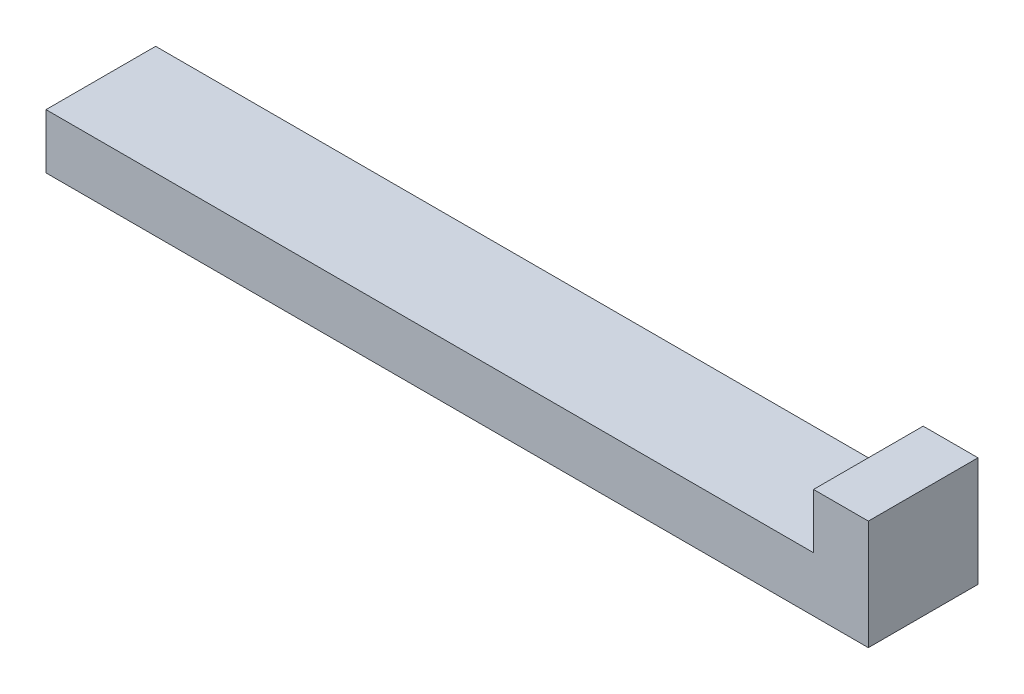
ISO-10303-21;
HEADER;
FILE_DESCRIPTION(('STEP AP214'),'2;1');
FILE_NAME('part.step','',(''),(''),'','','');
FILE_SCHEMA(('AUTOMOTIVE_DESIGN { 1 0 10303 214 1 1 1 1 }'));
ENDSEC;
DATA;
#1=APPLICATION_CONTEXT('core data for automotive mechanical design processes');
#2=APPLICATION_PROTOCOL_DEFINITION('international standard','automotive_design',2000,#1);
#3=PRODUCT_CONTEXT('',#1,'mechanical');
#4=PRODUCT('Part','Part','',(#3));
#5=PRODUCT_RELATED_PRODUCT_CATEGORY('part','',(#4));
#6=PRODUCT_DEFINITION_FORMATION('','',#4);
#7=PRODUCT_DEFINITION_CONTEXT('part definition',#1,'design');
#8=PRODUCT_DEFINITION('design','',#6,#7);
#9=PRODUCT_DEFINITION_SHAPE('','',#8);
#10=(LENGTH_UNIT() NAMED_UNIT(*) SI_UNIT(.MILLI.,.METRE.));
#11=(NAMED_UNIT(*) PLANE_ANGLE_UNIT() SI_UNIT($,.RADIAN.));
#12=(NAMED_UNIT(*) SI_UNIT($,.STERADIAN.) SOLID_ANGLE_UNIT());
#13=UNCERTAINTY_MEASURE_WITH_UNIT(LENGTH_MEASURE(1.E-05),#10,'distance_accuracy_value','');
#14=(GEOMETRIC_REPRESENTATION_CONTEXT(3) GLOBAL_UNCERTAINTY_ASSIGNED_CONTEXT((#13)) GLOBAL_UNIT_ASSIGNED_CONTEXT((#10,
#11,#12)) REPRESENTATION_CONTEXT('',''));
#15=CARTESIAN_POINT('',(0.,0.,0.));
#16=DIRECTION('',(0.,0.,1.));
#17=DIRECTION('',(1.,0.,0.));
#18=AXIS2_PLACEMENT_3D('',#15,#16,#17);
#19=CARTESIAN_POINT('',(0.,1.,2.));
#20=DIRECTION('',(1.,0.,0.));
#21=DIRECTION('',(0.,0.,-1.));
#22=AXIS2_PLACEMENT_3D('',#19,#20,#21);
#23=PLANE('',#22);
#24=DIRECTION('',(0.,-1.,0.));
#25=VECTOR('',#24,1.);
#26=CARTESIAN_POINT('',(0.,1.,0.));
#27=LINE('',#26,#25);
#28=CARTESIAN_POINT('',(0.,1.,0.));
#29=VERTEX_POINT('',#28);
#30=CARTESIAN_POINT('',(0.,0.,0.));
#31=VERTEX_POINT('',#30);
#32=EDGE_CURVE('E128',#29,#31,#27,.T.);
#33=ORIENTED_EDGE('',*,*,#32,.T.);
#34=DIRECTION('',(0.,0.,-1.));
#35=VECTOR('',#34,1.);
#36=CARTESIAN_POINT('',(0.,0.,2.));
#37=LINE('',#36,#35);
#38=CARTESIAN_POINT('',(0.,0.,2.));
#39=VERTEX_POINT('',#38);
#40=EDGE_CURVE('E11',#39,#31,#37,.T.);
#41=ORIENTED_EDGE('',*,*,#40,.F.);
#42=DIRECTION('',(0.,-1.,0.));
#43=VECTOR('',#42,1.);
#44=CARTESIAN_POINT('',(0.,1.,2.));
#45=LINE('',#44,#43);
#46=CARTESIAN_POINT('',(0.,1.,2.));
#47=VERTEX_POINT('',#46);
#48=EDGE_CURVE('E144',#47,#39,#45,.T.);
#49=ORIENTED_EDGE('',*,*,#48,.F.);
#50=DIRECTION('',(0.,0.,-1.));
#51=VECTOR('',#50,1.);
#52=CARTESIAN_POINT('',(0.,1.,2.));
#53=LINE('',#52,#51);
#54=EDGE_CURVE('E124',#47,#29,#53,.T.);
#55=ORIENTED_EDGE('',*,*,#54,.T.);
#56=EDGE_LOOP('',(#33,#41,#49,#55));
#57=FACE_BOUND('',#56,.T.);
#58=ADVANCED_FACE('F39',(#57),#23,.F.);
#59=CARTESIAN_POINT('',(0.,0.,2.));
#60=DIRECTION('',(0.,1.,0.));
#61=DIRECTION('',(0.,0.,1.));
#62=AXIS2_PLACEMENT_3D('',#59,#60,#61);
#63=PLANE('',#62);
#64=DIRECTION('',(1.,0.,0.));
#65=VECTOR('',#64,1.);
#66=CARTESIAN_POINT('',(0.,0.,0.));
#67=LINE('',#66,#65);
#68=CARTESIAN_POINT('',(15.,0.,0.));
#69=VERTEX_POINT('',#68);
#70=EDGE_CURVE('E132',#31,#69,#67,.T.);
#71=ORIENTED_EDGE('',*,*,#70,.T.);
#72=DIRECTION('',(0.,0.,-1.));
#73=VECTOR('',#72,1.);
#74=CARTESIAN_POINT('',(15.,0.,2.));
#75=LINE('',#74,#73);
#76=CARTESIAN_POINT('',(15.,0.,2.));
#77=VERTEX_POINT('',#76);
#78=EDGE_CURVE('E48',#77,#69,#75,.T.);
#79=ORIENTED_EDGE('',*,*,#78,.F.);
#80=DIRECTION('',(1.,0.,0.));
#81=VECTOR('',#80,1.);
#82=CARTESIAN_POINT('',(0.,0.,2.));
#83=LINE('',#82,#81);
#84=EDGE_CURVE('E93',#39,#77,#83,.T.);
#85=ORIENTED_EDGE('',*,*,#84,.F.);
#86=ORIENTED_EDGE('',*,*,#40,.T.);
#87=EDGE_LOOP('',(#71,#79,#85,#86));
#88=FACE_BOUND('',#87,.T.);
#89=ADVANCED_FACE('F172',(#88),#63,.F.);
#90=CARTESIAN_POINT('',(15.,0.,2.));
#91=DIRECTION('',(-1.,0.,0.));
#92=DIRECTION('',(0.,0.,1.));
#93=AXIS2_PLACEMENT_3D('',#90,#91,#92);
#94=PLANE('',#93);
#95=DIRECTION('',(0.,1.,0.));
#96=VECTOR('',#95,1.);
#97=CARTESIAN_POINT('',(15.,0.,0.));
#98=LINE('',#97,#96);
#99=CARTESIAN_POINT('',(15.,2.,0.));
#100=VERTEX_POINT('',#99);
#101=EDGE_CURVE('E135',#69,#100,#98,.T.);
#102=ORIENTED_EDGE('',*,*,#101,.T.);
#103=DIRECTION('',(0.,0.,-1.));
#104=VECTOR('',#103,1.);
#105=CARTESIAN_POINT('',(15.,2.,2.));
#106=LINE('',#105,#104);
#107=CARTESIAN_POINT('',(15.,2.,2.));
#108=VERTEX_POINT('',#107);
#109=EDGE_CURVE('E117',#108,#100,#106,.T.);
#110=ORIENTED_EDGE('',*,*,#109,.F.);
#111=DIRECTION('',(0.,1.,0.));
#112=VECTOR('',#111,1.);
#113=CARTESIAN_POINT('',(15.,0.,2.));
#114=LINE('',#113,#112);
#115=EDGE_CURVE('E106',#77,#108,#114,.T.);
#116=ORIENTED_EDGE('',*,*,#115,.F.);
#117=ORIENTED_EDGE('',*,*,#78,.T.);
#118=EDGE_LOOP('',(#102,#110,#116,#117));
#119=FACE_BOUND('',#118,.T.);
#120=ADVANCED_FACE('F154',(#119),#94,.F.);
#121=CARTESIAN_POINT('',(15.,2.,2.));
#122=DIRECTION('',(0.,-1.,0.));
#123=DIRECTION('',(0.,0.,-1.));
#124=AXIS2_PLACEMENT_3D('',#121,#122,#123);
#125=PLANE('',#124);
#126=DIRECTION('',(-1.,0.,0.));
#127=VECTOR('',#126,1.);
#128=CARTESIAN_POINT('',(15.,2.,0.));
#129=LINE('',#128,#127);
#130=CARTESIAN_POINT('',(14.,2.,0.));
#131=VERTEX_POINT('',#130);
#132=EDGE_CURVE('E115',#100,#131,#129,.T.);
#133=ORIENTED_EDGE('',*,*,#132,.T.);
#134=DIRECTION('',(0.,0.,-1.));
#135=VECTOR('',#134,1.);
#136=CARTESIAN_POINT('',(14.,2.,2.));
#137=LINE('',#136,#135);
#138=CARTESIAN_POINT('',(14.,2.,2.));
#139=VERTEX_POINT('',#138);
#140=EDGE_CURVE('E112',#139,#131,#137,.T.);
#141=ORIENTED_EDGE('',*,*,#140,.F.);
#142=DIRECTION('',(-1.,0.,0.));
#143=VECTOR('',#142,1.);
#144=CARTESIAN_POINT('',(15.,2.,2.));
#145=LINE('',#144,#143);
#146=EDGE_CURVE('E100',#108,#139,#145,.T.);
#147=ORIENTED_EDGE('',*,*,#146,.F.);
#148=ORIENTED_EDGE('',*,*,#109,.T.);
#149=EDGE_LOOP('',(#133,#141,#147,#148));
#150=FACE_BOUND('',#149,.T.);
#151=ADVANCED_FACE('F113',(#150),#125,.F.);
#152=CARTESIAN_POINT('',(14.,2.,2.));
#153=DIRECTION('',(1.,0.,0.));
#154=DIRECTION('',(0.,0.,-1.));
#155=AXIS2_PLACEMENT_3D('',#152,#153,#154);
#156=PLANE('',#155);
#157=DIRECTION('',(0.,-1.,0.));
#158=VECTOR('',#157,1.);
#159=CARTESIAN_POINT('',(14.,2.,0.));
#160=LINE('',#159,#158);
#161=CARTESIAN_POINT('',(14.,1.,0.));
#162=VERTEX_POINT('',#161);
#163=EDGE_CURVE('E79',#131,#162,#160,.T.);
#164=ORIENTED_EDGE('',*,*,#163,.T.);
#165=DIRECTION('',(0.,0.,-1.));
#166=VECTOR('',#165,1.);
#167=CARTESIAN_POINT('',(14.,1.,2.));
#168=LINE('',#167,#166);
#169=CARTESIAN_POINT('',(14.,1.,2.));
#170=VERTEX_POINT('',#169);
#171=EDGE_CURVE('E118',#170,#162,#168,.T.);
#172=ORIENTED_EDGE('',*,*,#171,.F.);
#173=DIRECTION('',(0.,-1.,0.));
#174=VECTOR('',#173,1.);
#175=CARTESIAN_POINT('',(14.,2.,2.));
#176=LINE('',#175,#174);
#177=EDGE_CURVE('E104',#139,#170,#176,.T.);
#178=ORIENTED_EDGE('',*,*,#177,.F.);
#179=ORIENTED_EDGE('',*,*,#140,.T.);
#180=EDGE_LOOP('',(#164,#172,#178,#179));
#181=FACE_BOUND('',#180,.T.);
#182=ADVANCED_FACE('F120',(#181),#156,.F.);
#183=CARTESIAN_POINT('',(14.,1.,2.));
#184=DIRECTION('',(0.,-1.,0.));
#185=DIRECTION('',(0.,0.,-1.));
#186=AXIS2_PLACEMENT_3D('',#183,#184,#185);
#187=PLANE('',#186);
#188=DIRECTION('',(-1.,0.,0.));
#189=VECTOR('',#188,1.);
#190=CARTESIAN_POINT('',(14.,1.,0.));
#191=LINE('',#190,#189);
#192=EDGE_CURVE('E85',#162,#29,#191,.T.);
#193=ORIENTED_EDGE('',*,*,#192,.T.);
#194=ORIENTED_EDGE('',*,*,#54,.F.);
#195=DIRECTION('',(-1.,0.,0.));
#196=VECTOR('',#195,1.);
#197=CARTESIAN_POINT('',(14.,1.,2.));
#198=LINE('',#197,#196);
#199=EDGE_CURVE('E56',#170,#47,#198,.T.);
#200=ORIENTED_EDGE('',*,*,#199,.F.);
#201=ORIENTED_EDGE('',*,*,#171,.T.);
#202=EDGE_LOOP('',(#193,#194,#200,#201));
#203=FACE_BOUND('',#202,.T.);
#204=ADVANCED_FACE('F161',(#203),#187,.F.);
#205=CARTESIAN_POINT('',(0.,0.,2.));
#206=DIRECTION('',(0.,0.,1.));
#207=DIRECTION('',(1.,0.,0.));
#208=AXIS2_PLACEMENT_3D('',#205,#206,#207);
#209=PLANE('',#208);
#210=ORIENTED_EDGE('',*,*,#48,.T.);
#211=ORIENTED_EDGE('',*,*,#84,.T.);
#212=ORIENTED_EDGE('',*,*,#115,.T.);
#213=ORIENTED_EDGE('',*,*,#146,.T.);
#214=ORIENTED_EDGE('',*,*,#177,.T.);
#215=ORIENTED_EDGE('',*,*,#199,.T.);
#216=EDGE_LOOP('',(#210,#211,#212,#213,#214,#215));
#217=FACE_BOUND('',#216,.T.);
#218=ADVANCED_FACE('F102',(#217),#209,.T.);
#219=CARTESIAN_POINT('',(0.,0.,0.));
#220=DIRECTION('',(0.,0.,1.));
#221=DIRECTION('',(1.,0.,0.));
#222=AXIS2_PLACEMENT_3D('',#219,#220,#221);
#223=PLANE('',#222);
#224=ORIENTED_EDGE('',*,*,#32,.F.);
#225=ORIENTED_EDGE('',*,*,#192,.F.);
#226=ORIENTED_EDGE('',*,*,#163,.F.);
#227=ORIENTED_EDGE('',*,*,#132,.F.);
#228=ORIENTED_EDGE('',*,*,#101,.F.);
#229=ORIENTED_EDGE('',*,*,#70,.F.);
#230=EDGE_LOOP('',(#224,#225,#226,#227,#228,#229));
#231=FACE_BOUND('',#230,.T.);
#232=ADVANCED_FACE('F157',(#231),#223,.F.);
#233=CLOSED_SHELL('',(#58,#89,#120,#151,#182,#204,#218,#232));
#234=MANIFOLD_SOLID_BREP('B2',#233);
#235=ADVANCED_BREP_SHAPE_REPRESENTATION('',(#18,#234),#14);
#236=SHAPE_DEFINITION_REPRESENTATION(#9,#235);
ENDSEC;
END-ISO-10303-21;
